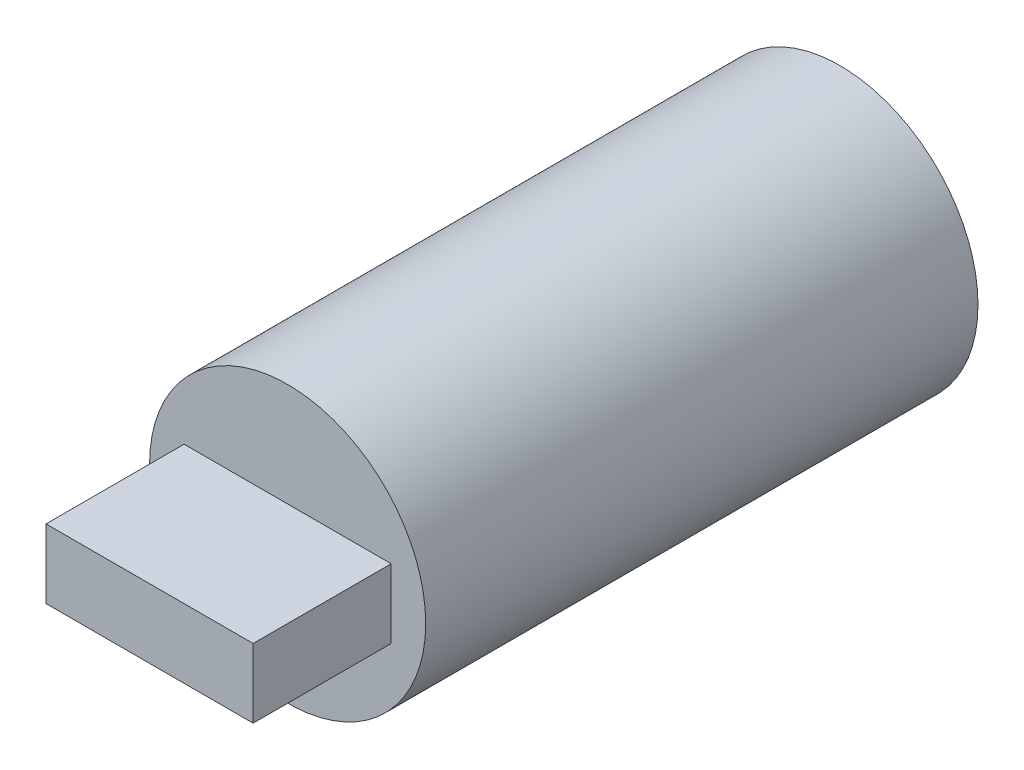
ISO-10303-21;
HEADER;
FILE_DESCRIPTION(('STEP AP214'),'2;1');
FILE_NAME('part.step','',(''),(''),'','','');
FILE_SCHEMA(('AUTOMOTIVE_DESIGN { 1 0 10303 214 1 1 1 1 }'));
ENDSEC;
DATA;
#1=APPLICATION_CONTEXT('core data for automotive mechanical design processes');
#2=APPLICATION_PROTOCOL_DEFINITION('international standard','automotive_design',2000,#1);
#3=PRODUCT_CONTEXT('',#1,'mechanical');
#4=PRODUCT('Part','Part','',(#3));
#5=PRODUCT_RELATED_PRODUCT_CATEGORY('part','',(#4));
#6=PRODUCT_DEFINITION_FORMATION('','',#4);
#7=PRODUCT_DEFINITION_CONTEXT('part definition',#1,'design');
#8=PRODUCT_DEFINITION('design','',#6,#7);
#9=PRODUCT_DEFINITION_SHAPE('','',#8);
#10=(LENGTH_UNIT() NAMED_UNIT(*) SI_UNIT(.MILLI.,.METRE.));
#11=(NAMED_UNIT(*) PLANE_ANGLE_UNIT() SI_UNIT($,.RADIAN.));
#12=(NAMED_UNIT(*) SI_UNIT($,.STERADIAN.) SOLID_ANGLE_UNIT());
#13=UNCERTAINTY_MEASURE_WITH_UNIT(LENGTH_MEASURE(1.E-05),#10,'distance_accuracy_value','');
#14=(GEOMETRIC_REPRESENTATION_CONTEXT(3) GLOBAL_UNCERTAINTY_ASSIGNED_CONTEXT((#13)) GLOBAL_UNIT_ASSIGNED_CONTEXT((#10,
#11,#12)) REPRESENTATION_CONTEXT('',''));
#15=CARTESIAN_POINT('',(0.,0.,0.));
#16=DIRECTION('',(0.,0.,1.));
#17=DIRECTION('',(1.,0.,0.));
#18=AXIS2_PLACEMENT_3D('',#15,#16,#17);
#19=CARTESIAN_POINT('',(0.,0.,40.));
#20=DIRECTION('',(0.,0.,-1.));
#21=DIRECTION('',(-1.,0.,0.));
#22=AXIS2_PLACEMENT_3D('',#19,#20,#21);
#23=CYLINDRICAL_SURFACE('',#22,10.);
#24=CARTESIAN_POINT('',(0.,0.,40.));
#25=DIRECTION('',(0.,0.,1.));
#26=DIRECTION('',(1.,0.,0.));
#27=AXIS2_PLACEMENT_3D('',#24,#25,#26);
#28=CIRCLE('',#27,10.);
#29=CARTESIAN_POINT('',(10.,0.,40.));
#30=VERTEX_POINT('',#29);
#31=EDGE_CURVE('E11',#30,#30,#28,.T.);
#32=ORIENTED_EDGE('',*,*,#31,.F.);
#33=EDGE_LOOP('',(#32));
#34=FACE_BOUND('',#33,.T.);
#35=CARTESIAN_POINT('',(0.,0.,0.));
#36=DIRECTION('',(0.,0.,1.));
#37=DIRECTION('',(1.,0.,0.));
#38=AXIS2_PLACEMENT_3D('',#35,#36,#37);
#39=CIRCLE('',#38,10.);
#40=CARTESIAN_POINT('',(10.,0.,0.));
#41=VERTEX_POINT('',#40);
#42=EDGE_CURVE('E41',#41,#41,#39,.T.);
#43=ORIENTED_EDGE('',*,*,#42,.T.);
#44=EDGE_LOOP('',(#43));
#45=FACE_BOUND('',#44,.T.);
#46=ADVANCED_FACE('F38',(#34,#45),#23,.T.);
#47=CARTESIAN_POINT('',(0.,0.,40.));
#48=DIRECTION('',(0.,0.,1.));
#49=DIRECTION('',(1.,0.,0.));
#50=AXIS2_PLACEMENT_3D('',#47,#48,#49);
#51=PLANE('',#50);
#52=DIRECTION('',(0.,1.,0.));
#53=VECTOR('',#52,1.);
#54=CARTESIAN_POINT('',(7.5,2.5,40.));
#55=LINE('',#54,#53);
#56=CARTESIAN_POINT('',(7.5,-2.5,40.));
#57=VERTEX_POINT('',#56);
#58=CARTESIAN_POINT('',(7.5,2.5,40.));
#59=VERTEX_POINT('',#58);
#60=EDGE_CURVE('E52',#57,#59,#55,.T.);
#61=ORIENTED_EDGE('',*,*,#60,.F.);
#62=DIRECTION('',(1.,0.,0.));
#63=VECTOR('',#62,1.);
#64=CARTESIAN_POINT('',(-7.5,-2.5,40.));
#65=LINE('',#64,#63);
#66=CARTESIAN_POINT('',(-7.5,-2.5,40.));
#67=VERTEX_POINT('',#66);
#68=EDGE_CURVE('E56',#67,#57,#65,.T.);
#69=ORIENTED_EDGE('',*,*,#68,.F.);
#70=DIRECTION('',(0.,-1.,0.));
#71=VECTOR('',#70,1.);
#72=CARTESIAN_POINT('',(-7.5,2.5,40.));
#73=LINE('',#72,#71);
#74=CARTESIAN_POINT('',(-7.5,2.5,40.));
#75=VERTEX_POINT('',#74);
#76=EDGE_CURVE('E108',#75,#67,#73,.T.);
#77=ORIENTED_EDGE('',*,*,#76,.F.);
#78=DIRECTION('',(-1.,0.,0.));
#79=VECTOR('',#78,1.);
#80=CARTESIAN_POINT('',(-7.5,2.5,40.));
#81=LINE('',#80,#79);
#82=EDGE_CURVE('E110',#59,#75,#81,.T.);
#83=ORIENTED_EDGE('',*,*,#82,.F.);
#84=EDGE_LOOP('',(#61,#69,#77,#83));
#85=FACE_BOUND('',#84,.T.);
#86=ORIENTED_EDGE('',*,*,#31,.T.);
#87=EDGE_LOOP('',(#86));
#88=FACE_BOUND('',#87,.T.);
#89=ADVANCED_FACE('F128',(#85,#88),#51,.T.);
#90=CARTESIAN_POINT('',(0.,0.,0.));
#91=DIRECTION('',(0.,0.,1.));
#92=DIRECTION('',(1.,0.,0.));
#93=AXIS2_PLACEMENT_3D('',#90,#91,#92);
#94=PLANE('',#93);
#95=ORIENTED_EDGE('',*,*,#42,.F.);
#96=EDGE_LOOP('',(#95));
#97=FACE_BOUND('',#96,.T.);
#98=ADVANCED_FACE('F133',(#97),#94,.F.);
#99=CARTESIAN_POINT('',(7.5,2.5,50.));
#100=DIRECTION('',(-1.,0.,0.));
#101=DIRECTION('',(0.,0.,1.));
#102=AXIS2_PLACEMENT_3D('',#99,#100,#101);
#103=PLANE('',#102);
#104=ORIENTED_EDGE('',*,*,#60,.T.);
#105=DIRECTION('',(0.,0.,-1.));
#106=VECTOR('',#105,1.);
#107=CARTESIAN_POINT('',(7.5,2.5,50.));
#108=LINE('',#107,#106);
#109=CARTESIAN_POINT('',(7.5,2.5,50.));
#110=VERTEX_POINT('',#109);
#111=EDGE_CURVE('E81',#110,#59,#108,.T.);
#112=ORIENTED_EDGE('',*,*,#111,.F.);
#113=DIRECTION('',(0.,1.,0.));
#114=VECTOR('',#113,1.);
#115=CARTESIAN_POINT('',(7.5,2.5,50.));
#116=LINE('',#115,#114);
#117=CARTESIAN_POINT('',(7.5,-2.5,50.));
#118=VERTEX_POINT('',#117);
#119=EDGE_CURVE('E87',#118,#110,#116,.T.);
#120=ORIENTED_EDGE('',*,*,#119,.F.);
#121=DIRECTION('',(0.,0.,-1.));
#122=VECTOR('',#121,1.);
#123=CARTESIAN_POINT('',(7.5,-2.5,50.));
#124=LINE('',#123,#122);
#125=EDGE_CURVE('E105',#118,#57,#124,.T.);
#126=ORIENTED_EDGE('',*,*,#125,.T.);
#127=EDGE_LOOP('',(#104,#112,#120,#126));
#128=FACE_BOUND('',#127,.T.);
#129=ADVANCED_FACE('F97',(#128),#103,.F.);
#130=CARTESIAN_POINT('',(-7.5,2.5,50.));
#131=DIRECTION('',(0.,-1.,0.));
#132=DIRECTION('',(0.,0.,-1.));
#133=AXIS2_PLACEMENT_3D('',#130,#131,#132);
#134=PLANE('',#133);
#135=ORIENTED_EDGE('',*,*,#82,.T.);
#136=DIRECTION('',(0.,0.,-1.));
#137=VECTOR('',#136,1.);
#138=CARTESIAN_POINT('',(-7.5,2.5,50.));
#139=LINE('',#138,#137);
#140=CARTESIAN_POINT('',(-7.5,2.5,50.));
#141=VERTEX_POINT('',#140);
#142=EDGE_CURVE('E83',#141,#75,#139,.T.);
#143=ORIENTED_EDGE('',*,*,#142,.F.);
#144=DIRECTION('',(-1.,0.,0.));
#145=VECTOR('',#144,1.);
#146=CARTESIAN_POINT('',(-7.5,2.5,50.));
#147=LINE('',#146,#145);
#148=EDGE_CURVE('E76',#110,#141,#147,.T.);
#149=ORIENTED_EDGE('',*,*,#148,.F.);
#150=ORIENTED_EDGE('',*,*,#111,.T.);
#151=EDGE_LOOP('',(#135,#143,#149,#150));
#152=FACE_BOUND('',#151,.T.);
#153=ADVANCED_FACE('F79',(#152),#134,.F.);
#154=CARTESIAN_POINT('',(-7.5,2.5,50.));
#155=DIRECTION('',(1.,0.,0.));
#156=DIRECTION('',(0.,1.,0.));
#157=AXIS2_PLACEMENT_3D('',#154,#155,#156);
#158=PLANE('',#157);
#159=ORIENTED_EDGE('',*,*,#76,.T.);
#160=DIRECTION('',(0.,0.,-1.));
#161=VECTOR('',#160,1.);
#162=CARTESIAN_POINT('',(-7.5,-2.5,50.));
#163=LINE('',#162,#161);
#164=CARTESIAN_POINT('',(-7.5,-2.5,50.));
#165=VERTEX_POINT('',#164);
#166=EDGE_CURVE('E100',#165,#67,#163,.T.);
#167=ORIENTED_EDGE('',*,*,#166,.F.);
#168=DIRECTION('',(0.,-1.,0.));
#169=VECTOR('',#168,1.);
#170=CARTESIAN_POINT('',(-7.5,2.5,50.));
#171=LINE('',#170,#169);
#172=EDGE_CURVE('E86',#141,#165,#171,.T.);
#173=ORIENTED_EDGE('',*,*,#172,.F.);
#174=ORIENTED_EDGE('',*,*,#142,.T.);
#175=EDGE_LOOP('',(#159,#167,#173,#174));
#176=FACE_BOUND('',#175,.T.);
#177=ADVANCED_FACE('F116',(#176),#158,.F.);
#178=CARTESIAN_POINT('',(-7.5,-2.5,50.));
#179=DIRECTION('',(0.,1.,0.));
#180=DIRECTION('',(0.,0.,1.));
#181=AXIS2_PLACEMENT_3D('',#178,#179,#180);
#182=PLANE('',#181);
#183=ORIENTED_EDGE('',*,*,#68,.T.);
#184=ORIENTED_EDGE('',*,*,#125,.F.);
#185=DIRECTION('',(1.,0.,0.));
#186=VECTOR('',#185,1.);
#187=CARTESIAN_POINT('',(-7.5,-2.5,50.));
#188=LINE('',#187,#186);
#189=EDGE_CURVE('E92',#165,#118,#188,.T.);
#190=ORIENTED_EDGE('',*,*,#189,.F.);
#191=ORIENTED_EDGE('',*,*,#166,.T.);
#192=EDGE_LOOP('',(#183,#184,#190,#191));
#193=FACE_BOUND('',#192,.T.);
#194=ADVANCED_FACE('F118',(#193),#182,.F.);
#195=CARTESIAN_POINT('',(0.,0.,50.));
#196=DIRECTION('',(0.,0.,1.));
#197=DIRECTION('',(1.,0.,0.));
#198=AXIS2_PLACEMENT_3D('',#195,#196,#197);
#199=PLANE('',#198);
#200=ORIENTED_EDGE('',*,*,#119,.T.);
#201=ORIENTED_EDGE('',*,*,#148,.T.);
#202=ORIENTED_EDGE('',*,*,#172,.T.);
#203=ORIENTED_EDGE('',*,*,#189,.T.);
#204=EDGE_LOOP('',(#200,#201,#202,#203));
#205=FACE_BOUND('',#204,.T.);
#206=ADVANCED_FACE('F90',(#205),#199,.T.);
#207=CLOSED_SHELL('',(#46,#89,#98,#129,#153,#177,#194,#206));
#208=MANIFOLD_SOLID_BREP('B2',#207);
#209=ADVANCED_BREP_SHAPE_REPRESENTATION('',(#18,#208),#14);
#210=SHAPE_DEFINITION_REPRESENTATION(#9,#209);
ENDSEC;
END-ISO-10303-21;
